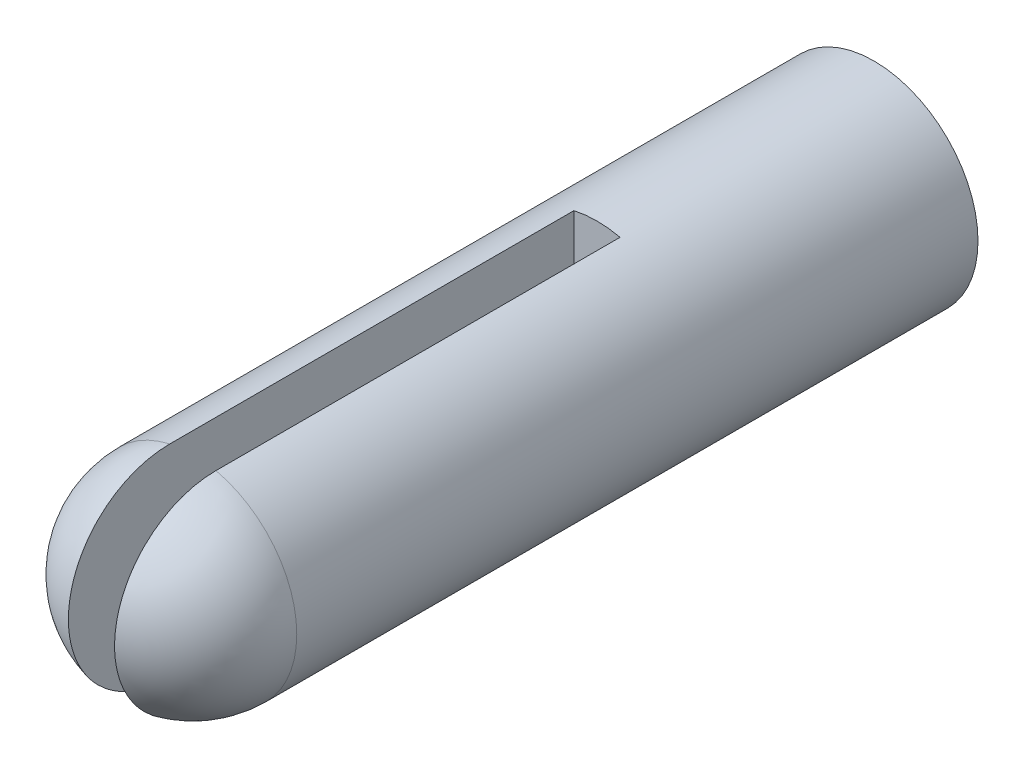
ISO-10303-21;
HEADER;
FILE_DESCRIPTION(('STEP AP214'),'2;1');
FILE_NAME('part.step','',(''),(''),'','','');
FILE_SCHEMA(('AUTOMOTIVE_DESIGN { 1 0 10303 214 1 1 1 1 }'));
ENDSEC;
DATA;
#1=APPLICATION_CONTEXT('core data for automotive mechanical design processes');
#2=APPLICATION_PROTOCOL_DEFINITION('international standard','automotive_design',2000,#1);
#3=PRODUCT_CONTEXT('',#1,'mechanical');
#4=PRODUCT('Part','Part','',(#3));
#5=PRODUCT_RELATED_PRODUCT_CATEGORY('part','',(#4));
#6=PRODUCT_DEFINITION_FORMATION('','',#4);
#7=PRODUCT_DEFINITION_CONTEXT('part definition',#1,'design');
#8=PRODUCT_DEFINITION('design','',#6,#7);
#9=PRODUCT_DEFINITION_SHAPE('','',#8);
#10=(LENGTH_UNIT() NAMED_UNIT(*) SI_UNIT(.MILLI.,.METRE.));
#11=(NAMED_UNIT(*) PLANE_ANGLE_UNIT() SI_UNIT($,.RADIAN.));
#12=(NAMED_UNIT(*) SI_UNIT($,.STERADIAN.) SOLID_ANGLE_UNIT());
#13=UNCERTAINTY_MEASURE_WITH_UNIT(LENGTH_MEASURE(1.E-05),#10,'distance_accuracy_value','');
#14=(GEOMETRIC_REPRESENTATION_CONTEXT(3) GLOBAL_UNCERTAINTY_ASSIGNED_CONTEXT((#13)) GLOBAL_UNIT_ASSIGNED_CONTEXT((#10,
#11,#12)) REPRESENTATION_CONTEXT('',''));
#15=CARTESIAN_POINT('',(0.,0.,0.));
#16=DIRECTION('',(0.,0.,1.));
#17=DIRECTION('',(1.,0.,0.));
#18=AXIS2_PLACEMENT_3D('',#15,#16,#17);
#19=CARTESIAN_POINT('',(0.,0.,295.));
#20=DIRECTION('',(0.,0.,1.));
#21=DIRECTION('',(1.,0.,0.));
#22=AXIS2_PLACEMENT_3D('',#19,#20,#21);
#23=SPHERICAL_SURFACE('',#22,45.);
#24=CARTESIAN_POINT('',(0.,0.,295.));
#25=DIRECTION('',(0.,0.,-1.));
#26=DIRECTION('',(-1.,0.,0.));
#27=AXIS2_PLACEMENT_3D('',#24,#25,#26);
#28=CIRCLE('',#27,45.);
#29=CARTESIAN_POINT('',(-10.,-43.8748219369606,295.));
#30=VERTEX_POINT('',#29);
#31=CARTESIAN_POINT('',(-10.,43.8748219369606,295.));
#32=VERTEX_POINT('',#31);
#33=EDGE_CURVE('E107',#30,#32,#28,.T.);
#34=ORIENTED_EDGE('',*,*,#33,.F.);
#35=CARTESIAN_POINT('',(-10.,0.,295.));
#36=DIRECTION('',(1.,0.,0.));
#37=DIRECTION('',(0.,0.,-1.));
#38=AXIS2_PLACEMENT_3D('',#35,#36,#37);
#39=CIRCLE('',#38,43.8748219369606);
#40=EDGE_CURVE('E115',#30,#32,#39,.F.);
#41=ORIENTED_EDGE('',*,*,#40,.T.);
#42=EDGE_LOOP('',(#34,#41));
#43=FACE_BOUND('',#42,.T.);
#44=ADVANCED_FACE('F45',(#43),#23,.T.);
#45=CARTESIAN_POINT('',(0.,0.,340.));
#46=DIRECTION('',(0.,0.,-1.));
#47=DIRECTION('',(-1.,0.,0.));
#48=AXIS2_PLACEMENT_3D('',#45,#46,#47);
#49=CYLINDRICAL_SURFACE('',#48,45.);
#50=CARTESIAN_POINT('',(0.,0.,0.));
#51=DIRECTION('',(0.,0.,1.));
#52=DIRECTION('',(1.,0.,0.));
#53=AXIS2_PLACEMENT_3D('',#50,#51,#52);
#54=CIRCLE('',#53,45.);
#55=CARTESIAN_POINT('',(45.,0.,0.));
#56=VERTEX_POINT('',#55);
#57=EDGE_CURVE('E106',#56,#56,#54,.T.);
#58=ORIENTED_EDGE('',*,*,#57,.T.);
#59=EDGE_LOOP('',(#58));
#60=FACE_BOUND('',#59,.T.);
#61=CARTESIAN_POINT('',(0.,0.,120.));
#62=DIRECTION('',(0.,0.,1.));
#63=DIRECTION('',(1.,0.,0.));
#64=AXIS2_PLACEMENT_3D('',#61,#62,#63);
#65=CIRCLE('',#64,45.);
#66=CARTESIAN_POINT('',(9.99999999999999,43.8748219369606,120.));
#67=VERTEX_POINT('',#66);
#68=CARTESIAN_POINT('',(-9.99999999999999,43.8748219369606,120.));
#69=VERTEX_POINT('',#68);
#70=EDGE_CURVE('E12',#67,#69,#65,.T.);
#71=ORIENTED_EDGE('',*,*,#70,.F.);
#72=DIRECTION('',(0.,0.,-1.));
#73=VECTOR('',#72,1.);
#74=CARTESIAN_POINT('',(10.,43.8748219369606,340.));
#75=LINE('',#74,#73);
#76=CARTESIAN_POINT('',(10.,43.8748219369606,295.));
#77=VERTEX_POINT('',#76);
#78=EDGE_CURVE('E86',#67,#77,#75,.F.);
#79=ORIENTED_EDGE('',*,*,#78,.T.);
#80=CARTESIAN_POINT('',(10.,-43.8748219369606,295.));
#81=VERTEX_POINT('',#80);
#82=EDGE_CURVE('E111',#77,#81,#28,.T.);
#83=ORIENTED_EDGE('',*,*,#82,.T.);
#84=DIRECTION('',(0.,0.,-1.));
#85=VECTOR('',#84,1.);
#86=CARTESIAN_POINT('',(10.,-43.8748219369606,340.));
#87=LINE('',#86,#85);
#88=CARTESIAN_POINT('',(9.99999999999999,-43.8748219369606,120.));
#89=VERTEX_POINT('',#88);
#90=EDGE_CURVE('E60',#81,#89,#87,.T.);
#91=ORIENTED_EDGE('',*,*,#90,.T.);
#92=CARTESIAN_POINT('',(-9.99999999999999,-43.8748219369606,120.));
#93=VERTEX_POINT('',#92);
#94=EDGE_CURVE('E46',#93,#89,#65,.T.);
#95=ORIENTED_EDGE('',*,*,#94,.F.);
#96=DIRECTION('',(0.,0.,-1.));
#97=VECTOR('',#96,1.);
#98=CARTESIAN_POINT('',(-10.,-43.8748219369606,340.));
#99=LINE('',#98,#97);
#100=EDGE_CURVE('E101',#30,#93,#99,.T.);
#101=ORIENTED_EDGE('',*,*,#100,.F.);
#102=ORIENTED_EDGE('',*,*,#33,.T.);
#103=DIRECTION('',(0.,0.,-1.));
#104=VECTOR('',#103,1.);
#105=CARTESIAN_POINT('',(-10.,43.8748219369606,340.));
#106=LINE('',#105,#104);
#107=EDGE_CURVE('E63',#69,#32,#106,.F.);
#108=ORIENTED_EDGE('',*,*,#107,.F.);
#109=EDGE_LOOP('',(#71,#79,#83,#91,#95,#101,#102,#108));
#110=FACE_BOUND('',#109,.T.);
#111=ADVANCED_FACE('F81',(#60,#110),#49,.T.);
#112=CARTESIAN_POINT('',(0.,0.,0.));
#113=DIRECTION('',(0.,0.,1.));
#114=DIRECTION('',(1.,0.,0.));
#115=AXIS2_PLACEMENT_3D('',#112,#113,#114);
#116=PLANE('',#115);
#117=ORIENTED_EDGE('',*,*,#57,.F.);
#118=EDGE_LOOP('',(#117));
#119=FACE_BOUND('',#118,.T.);
#120=ADVANCED_FACE('F126',(#119),#116,.F.);
#121=CARTESIAN_POINT('',(10.,0.,295.));
#122=DIRECTION('',(1.,0.,0.));
#123=DIRECTION('',(0.,0.,-1.));
#124=AXIS2_PLACEMENT_3D('',#121,#122,#123);
#125=CIRCLE('',#124,43.8748219369606);
#126=EDGE_CURVE('E91',#81,#77,#125,.F.);
#127=ORIENTED_EDGE('',*,*,#126,.F.);
#128=ORIENTED_EDGE('',*,*,#82,.F.);
#129=EDGE_LOOP('',(#127,#128));
#130=FACE_BOUND('',#129,.T.);
#131=ADVANCED_FACE('F42',(#130),#23,.T.);
#132=CARTESIAN_POINT('',(-10.,-45.0000000000002,120.));
#133=DIRECTION('',(0.,0.,1.));
#134=DIRECTION('',(1.,0.,0.));
#135=AXIS2_PLACEMENT_3D('',#132,#133,#134);
#136=PLANE('',#135);
#137=DIRECTION('',(0.,-1.,0.));
#138=VECTOR('',#137,1.);
#139=CARTESIAN_POINT('',(10.,-45.0000000000002,120.));
#140=LINE('',#139,#138);
#141=EDGE_CURVE('E95',#67,#89,#140,.T.);
#142=ORIENTED_EDGE('',*,*,#141,.F.);
#143=ORIENTED_EDGE('',*,*,#70,.T.);
#144=DIRECTION('',(0.,-1.,0.));
#145=VECTOR('',#144,1.);
#146=CARTESIAN_POINT('',(-10.,-45.0000000000002,120.));
#147=LINE('',#146,#145);
#148=EDGE_CURVE('E93',#69,#93,#147,.T.);
#149=ORIENTED_EDGE('',*,*,#148,.T.);
#150=ORIENTED_EDGE('',*,*,#94,.T.);
#151=EDGE_LOOP('',(#142,#143,#149,#150));
#152=FACE_BOUND('',#151,.T.);
#153=ADVANCED_FACE('F97',(#152),#136,.T.);
#154=CARTESIAN_POINT('',(-10.,0.,155.));
#155=DIRECTION('',(1.,0.,0.));
#156=DIRECTION('',(0.,0.,-1.));
#157=AXIS2_PLACEMENT_3D('',#154,#155,#156);
#158=PLANE('',#157);
#159=ORIENTED_EDGE('',*,*,#100,.T.);
#160=ORIENTED_EDGE('',*,*,#148,.F.);
#161=ORIENTED_EDGE('',*,*,#107,.T.);
#162=ORIENTED_EDGE('',*,*,#40,.F.);
#163=EDGE_LOOP('',(#159,#160,#161,#162));
#164=FACE_BOUND('',#163,.T.);
#165=ADVANCED_FACE('F116',(#164),#158,.T.);
#166=CARTESIAN_POINT('',(10.,0.,155.));
#167=DIRECTION('',(1.,0.,0.));
#168=DIRECTION('',(0.,0.,-1.));
#169=AXIS2_PLACEMENT_3D('',#166,#167,#168);
#170=PLANE('',#169);
#171=ORIENTED_EDGE('',*,*,#126,.T.);
#172=ORIENTED_EDGE('',*,*,#78,.F.);
#173=ORIENTED_EDGE('',*,*,#141,.T.);
#174=ORIENTED_EDGE('',*,*,#90,.F.);
#175=EDGE_LOOP('',(#171,#172,#173,#174));
#176=FACE_BOUND('',#175,.T.);
#177=ADVANCED_FACE('F94',(#176),#170,.F.);
#178=CLOSED_SHELL('',(#44,#111,#120,#131,#153,#165,#177));
#179=MANIFOLD_SOLID_BREP('B2',#178);
#180=ADVANCED_BREP_SHAPE_REPRESENTATION('',(#18,#179),#14);
#181=SHAPE_DEFINITION_REPRESENTATION(#9,#180);
ENDSEC;
END-ISO-10303-21;
